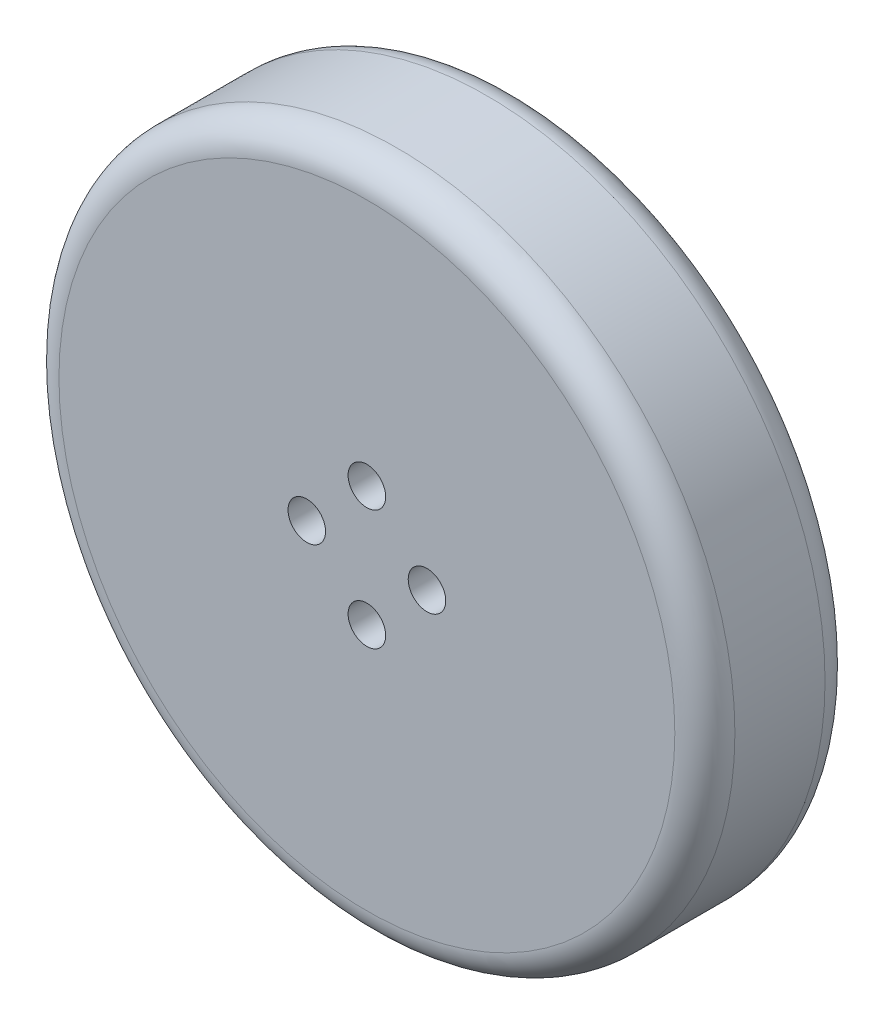
ISO-10303-21;
HEADER;
FILE_DESCRIPTION(('STEP AP214'),'2;1');
FILE_NAME('part.step','',(''),(''),'','','');
FILE_SCHEMA(('AUTOMOTIVE_DESIGN { 1 0 10303 214 1 1 1 1 }'));
ENDSEC;
DATA;
#1=APPLICATION_CONTEXT('core data for automotive mechanical design processes');
#2=APPLICATION_PROTOCOL_DEFINITION('international standard','automotive_design',2000,#1);
#3=PRODUCT_CONTEXT('',#1,'mechanical');
#4=PRODUCT('Part','Part','',(#3));
#5=PRODUCT_RELATED_PRODUCT_CATEGORY('part','',(#4));
#6=PRODUCT_DEFINITION_FORMATION('','',#4);
#7=PRODUCT_DEFINITION_CONTEXT('part definition',#1,'design');
#8=PRODUCT_DEFINITION('design','',#6,#7);
#9=PRODUCT_DEFINITION_SHAPE('','',#8);
#10=(LENGTH_UNIT() NAMED_UNIT(*) SI_UNIT(.MILLI.,.METRE.));
#11=(NAMED_UNIT(*) PLANE_ANGLE_UNIT() SI_UNIT($,.RADIAN.));
#12=(NAMED_UNIT(*) SI_UNIT($,.STERADIAN.) SOLID_ANGLE_UNIT());
#13=UNCERTAINTY_MEASURE_WITH_UNIT(LENGTH_MEASURE(1.E-05),#10,'distance_accuracy_value','');
#14=(GEOMETRIC_REPRESENTATION_CONTEXT(3) GLOBAL_UNCERTAINTY_ASSIGNED_CONTEXT((#13)) GLOBAL_UNIT_ASSIGNED_CONTEXT((#10,
#11,#12)) REPRESENTATION_CONTEXT('',''));
#15=CARTESIAN_POINT('',(0.,0.,0.));
#16=DIRECTION('',(0.,0.,1.));
#17=DIRECTION('',(1.,0.,0.));
#18=AXIS2_PLACEMENT_3D('',#15,#16,#17);
#19=CARTESIAN_POINT('',(4.,0.,10.));
#20=DIRECTION('',(0.,0.,-1.));
#21=DIRECTION('',(-1.,0.,0.));
#22=AXIS2_PLACEMENT_3D('',#19,#20,#21);
#23=CYLINDRICAL_SURFACE('',#22,1.25);
#24=CARTESIAN_POINT('',(4.,0.,10.));
#25=DIRECTION('',(0.,0.,1.));
#26=DIRECTION('',(1.,0.,0.));
#27=AXIS2_PLACEMENT_3D('',#24,#25,#26);
#28=CIRCLE('',#27,1.25);
#29=CARTESIAN_POINT('',(5.25,0.,10.));
#30=VERTEX_POINT('',#29);
#31=EDGE_CURVE('E57',#30,#30,#28,.T.);
#32=ORIENTED_EDGE('',*,*,#31,.T.);
#33=EDGE_LOOP('',(#32));
#34=FACE_BOUND('',#33,.T.);
#35=CARTESIAN_POINT('',(4.,0.,4.));
#36=DIRECTION('',(0.,0.,-1.));
#37=DIRECTION('',(-1.,0.,0.));
#38=AXIS2_PLACEMENT_3D('',#35,#36,#37);
#39=CIRCLE('',#38,1.25);
#40=CARTESIAN_POINT('',(2.75,0.,4.));
#41=VERTEX_POINT('',#40);
#42=EDGE_CURVE('E74',#41,#41,#39,.T.);
#43=ORIENTED_EDGE('',*,*,#42,.T.);
#44=EDGE_LOOP('',(#43));
#45=FACE_BOUND('',#44,.T.);
#46=ADVANCED_FACE('F37',(#34,#45),#23,.F.);
#47=CARTESIAN_POINT('',(0.,4.,10.));
#48=DIRECTION('',(0.,0.,-1.));
#49=DIRECTION('',(-1.,0.,0.));
#50=AXIS2_PLACEMENT_3D('',#47,#48,#49);
#51=CYLINDRICAL_SURFACE('',#50,1.25);
#52=CARTESIAN_POINT('',(0.,4.,10.));
#53=DIRECTION('',(0.,0.,1.));
#54=DIRECTION('',(1.,0.,0.));
#55=AXIS2_PLACEMENT_3D('',#52,#53,#54);
#56=CIRCLE('',#55,1.25);
#57=CARTESIAN_POINT('',(1.25,4.,10.));
#58=VERTEX_POINT('',#57);
#59=EDGE_CURVE('E65',#58,#58,#56,.T.);
#60=ORIENTED_EDGE('',*,*,#59,.T.);
#61=EDGE_LOOP('',(#60));
#62=FACE_BOUND('',#61,.T.);
#63=CARTESIAN_POINT('',(0.,4.,4.));
#64=DIRECTION('',(0.,0.,-1.));
#65=DIRECTION('',(-1.,0.,0.));
#66=AXIS2_PLACEMENT_3D('',#63,#64,#65);
#67=CIRCLE('',#66,1.25);
#68=CARTESIAN_POINT('',(-1.25,4.,4.));
#69=VERTEX_POINT('',#68);
#70=EDGE_CURVE('E77',#69,#69,#67,.T.);
#71=ORIENTED_EDGE('',*,*,#70,.T.);
#72=EDGE_LOOP('',(#71));
#73=FACE_BOUND('',#72,.T.);
#74=ADVANCED_FACE('F110',(#62,#73),#51,.F.);
#75=CARTESIAN_POINT('',(-4.,0.,10.));
#76=DIRECTION('',(0.,0.,-1.));
#77=DIRECTION('',(-1.,0.,0.));
#78=AXIS2_PLACEMENT_3D('',#75,#76,#77);
#79=CYLINDRICAL_SURFACE('',#78,1.25);
#80=CARTESIAN_POINT('',(-4.,0.,10.));
#81=DIRECTION('',(0.,0.,1.));
#82=DIRECTION('',(1.,0.,0.));
#83=AXIS2_PLACEMENT_3D('',#80,#81,#82);
#84=CIRCLE('',#83,1.25);
#85=CARTESIAN_POINT('',(-2.75,0.,10.));
#86=VERTEX_POINT('',#85);
#87=EDGE_CURVE('E68',#86,#86,#84,.T.);
#88=ORIENTED_EDGE('',*,*,#87,.T.);
#89=EDGE_LOOP('',(#88));
#90=FACE_BOUND('',#89,.T.);
#91=CARTESIAN_POINT('',(-4.,0.,4.));
#92=DIRECTION('',(0.,0.,-1.));
#93=DIRECTION('',(-1.,0.,0.));
#94=AXIS2_PLACEMENT_3D('',#91,#92,#93);
#95=CIRCLE('',#94,1.25);
#96=CARTESIAN_POINT('',(-5.25,0.,4.));
#97=VERTEX_POINT('',#96);
#98=EDGE_CURVE('E61',#97,#97,#95,.T.);
#99=ORIENTED_EDGE('',*,*,#98,.T.);
#100=EDGE_LOOP('',(#99));
#101=FACE_BOUND('',#100,.T.);
#102=ADVANCED_FACE('F116',(#90,#101),#79,.F.);
#103=CARTESIAN_POINT('',(0.,-4.,10.));
#104=DIRECTION('',(0.,0.,-1.));
#105=DIRECTION('',(-1.,0.,0.));
#106=AXIS2_PLACEMENT_3D('',#103,#104,#105);
#107=CYLINDRICAL_SURFACE('',#106,1.25);
#108=CARTESIAN_POINT('',(0.,-4.,10.));
#109=DIRECTION('',(0.,0.,1.));
#110=DIRECTION('',(1.,0.,0.));
#111=AXIS2_PLACEMENT_3D('',#108,#109,#110);
#112=CIRCLE('',#111,1.25);
#113=CARTESIAN_POINT('',(1.25,-4.,10.));
#114=VERTEX_POINT('',#113);
#115=EDGE_CURVE('E71',#114,#114,#112,.T.);
#116=ORIENTED_EDGE('',*,*,#115,.T.);
#117=EDGE_LOOP('',(#116));
#118=FACE_BOUND('',#117,.T.);
#119=CARTESIAN_POINT('',(0.,-4.,4.));
#120=DIRECTION('',(0.,0.,-1.));
#121=DIRECTION('',(-1.,0.,0.));
#122=AXIS2_PLACEMENT_3D('',#119,#120,#121);
#123=CIRCLE('',#122,1.25);
#124=CARTESIAN_POINT('',(-1.25,-4.,4.));
#125=VERTEX_POINT('',#124);
#126=EDGE_CURVE('E58',#125,#125,#123,.T.);
#127=ORIENTED_EDGE('',*,*,#126,.T.);
#128=EDGE_LOOP('',(#127));
#129=FACE_BOUND('',#128,.T.);
#130=ADVANCED_FACE('F107',(#118,#129),#107,.F.);
#131=CARTESIAN_POINT('',(0.,0.,10.));
#132=DIRECTION('',(0.,0.,1.));
#133=DIRECTION('',(1.,0.,0.));
#134=AXIS2_PLACEMENT_3D('',#131,#132,#133);
#135=PLANE('',#134);
#136=CARTESIAN_POINT('',(0.,0.,10.));
#137=DIRECTION('',(0.,0.,1.));
#138=DIRECTION('',(1.,0.,0.));
#139=AXIS2_PLACEMENT_3D('',#136,#137,#138);
#140=CIRCLE('',#139,20.5);
#141=CARTESIAN_POINT('',(20.5,0.,10.));
#142=VERTEX_POINT('',#141);
#143=EDGE_CURVE('E10',#142,#142,#140,.T.);
#144=ORIENTED_EDGE('',*,*,#143,.T.);
#145=EDGE_LOOP('',(#144));
#146=FACE_BOUND('',#145,.T.);
#147=ORIENTED_EDGE('',*,*,#87,.F.);
#148=EDGE_LOOP('',(#147));
#149=FACE_BOUND('',#148,.T.);
#150=ORIENTED_EDGE('',*,*,#31,.F.);
#151=EDGE_LOOP('',(#150));
#152=FACE_BOUND('',#151,.T.);
#153=ORIENTED_EDGE('',*,*,#59,.F.);
#154=EDGE_LOOP('',(#153));
#155=FACE_BOUND('',#154,.T.);
#156=ORIENTED_EDGE('',*,*,#115,.F.);
#157=EDGE_LOOP('',(#156));
#158=FACE_BOUND('',#157,.T.);
#159=ADVANCED_FACE('F99',(#146,#149,#152,#155,#158),#135,.T.);
#160=CARTESIAN_POINT('',(0.,0.,0.));
#161=DIRECTION('',(0.,0.,1.));
#162=DIRECTION('',(1.,0.,0.));
#163=AXIS2_PLACEMENT_3D('',#160,#161,#162);
#164=PLANE('',#163);
#165=CARTESIAN_POINT('',(0.,0.,0.));
#166=DIRECTION('',(0.,0.,1.));
#167=DIRECTION('',(1.,0.,0.));
#168=AXIS2_PLACEMENT_3D('',#165,#166,#167);
#169=CIRCLE('',#168,20.5);
#170=CARTESIAN_POINT('',(20.5,0.,0.));
#171=VERTEX_POINT('',#170);
#172=EDGE_CURVE('E44',#171,#171,#169,.F.);
#173=ORIENTED_EDGE('',*,*,#172,.T.);
#174=EDGE_LOOP('',(#173));
#175=FACE_BOUND('',#174,.T.);
#176=CARTESIAN_POINT('',(0.,0.,0.));
#177=DIRECTION('',(0.,0.,-1.));
#178=DIRECTION('',(-1.,0.,0.));
#179=AXIS2_PLACEMENT_3D('',#176,#177,#178);
#180=CIRCLE('',#179,10.);
#181=CARTESIAN_POINT('',(-10.,0.,0.));
#182=VERTEX_POINT('',#181);
#183=EDGE_CURVE('E82',#182,#182,#180,.T.);
#184=ORIENTED_EDGE('',*,*,#183,.F.);
#185=EDGE_LOOP('',(#184));
#186=FACE_BOUND('',#185,.T.);
#187=ADVANCED_FACE('F97',(#175,#186),#164,.F.);
#188=CARTESIAN_POINT('',(0.,0.,10.));
#189=DIRECTION('',(0.,0.,-1.));
#190=DIRECTION('',(-1.,0.,0.));
#191=AXIS2_PLACEMENT_3D('',#188,#189,#190);
#192=CYLINDRICAL_SURFACE('',#191,22.5);
#193=CARTESIAN_POINT('',(0.,0.,2.));
#194=DIRECTION('',(0.,0.,1.));
#195=DIRECTION('',(1.,0.,0.));
#196=AXIS2_PLACEMENT_3D('',#193,#194,#195);
#197=CIRCLE('',#196,22.5);
#198=CARTESIAN_POINT('',(22.5,0.,2.));
#199=VERTEX_POINT('',#198);
#200=EDGE_CURVE('E48',#199,#199,#197,.T.);
#201=ORIENTED_EDGE('',*,*,#200,.T.);
#202=EDGE_LOOP('',(#201));
#203=FACE_BOUND('',#202,.T.);
#204=CARTESIAN_POINT('',(0.,0.,8.));
#205=DIRECTION('',(0.,0.,1.));
#206=DIRECTION('',(1.,0.,0.));
#207=AXIS2_PLACEMENT_3D('',#204,#205,#206);
#208=CIRCLE('',#207,22.5);
#209=CARTESIAN_POINT('',(22.5,0.,8.));
#210=VERTEX_POINT('',#209);
#211=EDGE_CURVE('E52',#210,#210,#208,.F.);
#212=ORIENTED_EDGE('',*,*,#211,.T.);
#213=EDGE_LOOP('',(#212));
#214=FACE_BOUND('',#213,.T.);
#215=ADVANCED_FACE('F93',(#203,#214),#192,.T.);
#216=CARTESIAN_POINT('',(0.,0.,4.));
#217=DIRECTION('',(0.,0.,-1.));
#218=DIRECTION('',(-1.,0.,0.));
#219=AXIS2_PLACEMENT_3D('',#216,#217,#218);
#220=CYLINDRICAL_SURFACE('',#219,10.);
#221=CARTESIAN_POINT('',(0.,0.,4.));
#222=DIRECTION('',(0.,0.,-1.));
#223=DIRECTION('',(-1.,0.,0.));
#224=AXIS2_PLACEMENT_3D('',#221,#222,#223);
#225=CIRCLE('',#224,10.);
#226=CARTESIAN_POINT('',(-10.,0.,4.));
#227=VERTEX_POINT('',#226);
#228=EDGE_CURVE('E62',#227,#227,#225,.T.);
#229=ORIENTED_EDGE('',*,*,#228,.F.);
#230=EDGE_LOOP('',(#229));
#231=FACE_BOUND('',#230,.T.);
#232=ORIENTED_EDGE('',*,*,#183,.T.);
#233=EDGE_LOOP('',(#232));
#234=FACE_BOUND('',#233,.T.);
#235=ADVANCED_FACE('F90',(#231,#234),#220,.F.);
#236=CARTESIAN_POINT('',(0.,0.,4.));
#237=DIRECTION('',(0.,0.,-1.));
#238=DIRECTION('',(-1.,0.,0.));
#239=AXIS2_PLACEMENT_3D('',#236,#237,#238);
#240=PLANE('',#239);
#241=ORIENTED_EDGE('',*,*,#42,.F.);
#242=EDGE_LOOP('',(#241));
#243=FACE_BOUND('',#242,.T.);
#244=ORIENTED_EDGE('',*,*,#70,.F.);
#245=EDGE_LOOP('',(#244));
#246=FACE_BOUND('',#245,.T.);
#247=ORIENTED_EDGE('',*,*,#98,.F.);
#248=EDGE_LOOP('',(#247));
#249=FACE_BOUND('',#248,.T.);
#250=ORIENTED_EDGE('',*,*,#126,.F.);
#251=EDGE_LOOP('',(#250));
#252=FACE_BOUND('',#251,.T.);
#253=ORIENTED_EDGE('',*,*,#228,.T.);
#254=EDGE_LOOP('',(#253));
#255=FACE_BOUND('',#254,.T.);
#256=ADVANCED_FACE('F88',(#243,#246,#249,#252,#255),#240,.T.);
#257=CARTESIAN_POINT('',(0.,0.,2.));
#258=DIRECTION('',(0.,0.,1.));
#259=DIRECTION('',(1.,0.,0.));
#260=AXIS2_PLACEMENT_3D('',#257,#258,#259);
#261=TOROIDAL_SURFACE('',#260,20.5,2.);
#262=ORIENTED_EDGE('',*,*,#172,.F.);
#263=EDGE_LOOP('',(#262));
#264=FACE_BOUND('',#263,.T.);
#265=ORIENTED_EDGE('',*,*,#200,.F.);
#266=EDGE_LOOP('',(#265));
#267=FACE_BOUND('',#266,.T.);
#268=ADVANCED_FACE('F128',(#264,#267),#261,.T.);
#269=CARTESIAN_POINT('',(0.,0.,8.));
#270=DIRECTION('',(0.,0.,1.));
#271=DIRECTION('',(1.,0.,0.));
#272=AXIS2_PLACEMENT_3D('',#269,#270,#271);
#273=TOROIDAL_SURFACE('',#272,20.5,2.);
#274=ORIENTED_EDGE('',*,*,#211,.F.);
#275=EDGE_LOOP('',(#274));
#276=FACE_BOUND('',#275,.T.);
#277=ORIENTED_EDGE('',*,*,#143,.F.);
#278=EDGE_LOOP('',(#277));
#279=FACE_BOUND('',#278,.T.);
#280=ADVANCED_FACE('F39',(#276,#279),#273,.T.);
#281=CLOSED_SHELL('',(#46,#74,#102,#130,#159,#187,#215,#235,#256,#268,#280));
#282=MANIFOLD_SOLID_BREP('B2',#281);
#283=ADVANCED_BREP_SHAPE_REPRESENTATION('',(#18,#282),#14);
#284=SHAPE_DEFINITION_REPRESENTATION(#9,#283);
ENDSEC;
END-ISO-10303-21;
